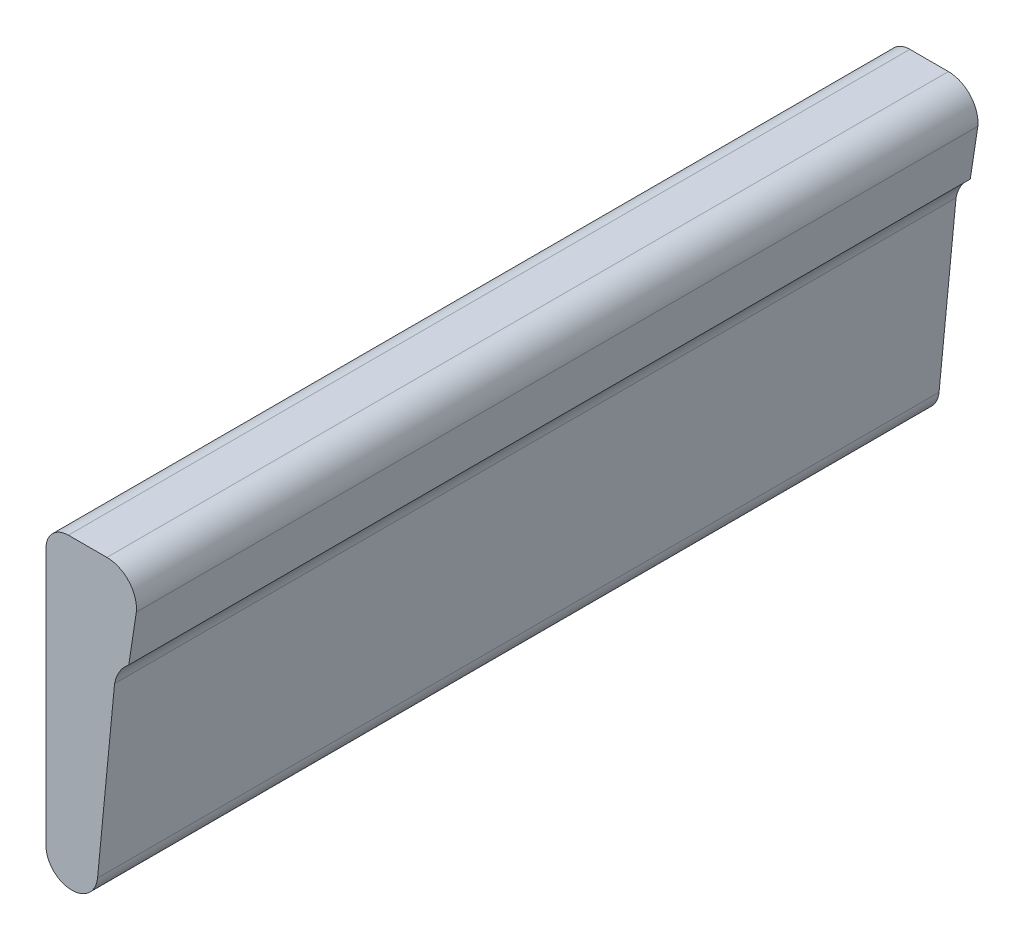
ISO-10303-21;
HEADER;
FILE_DESCRIPTION(('STEP AP214'),'2;1');
FILE_NAME('part.step','',(''),(''),'','','');
FILE_SCHEMA(('AUTOMOTIVE_DESIGN { 1 0 10303 214 1 1 1 1 }'));
ENDSEC;
DATA;
#1=APPLICATION_CONTEXT('core data for automotive mechanical design processes');
#2=APPLICATION_PROTOCOL_DEFINITION('international standard','automotive_design',2000,#1);
#3=PRODUCT_CONTEXT('',#1,'mechanical');
#4=PRODUCT('Part','Part','',(#3));
#5=PRODUCT_RELATED_PRODUCT_CATEGORY('part','',(#4));
#6=PRODUCT_DEFINITION_FORMATION('','',#4);
#7=PRODUCT_DEFINITION_CONTEXT('part definition',#1,'design');
#8=PRODUCT_DEFINITION('design','',#6,#7);
#9=PRODUCT_DEFINITION_SHAPE('','',#8);
#10=(LENGTH_UNIT() NAMED_UNIT(*) SI_UNIT(.MILLI.,.METRE.));
#11=(NAMED_UNIT(*) PLANE_ANGLE_UNIT() SI_UNIT($,.RADIAN.));
#12=(NAMED_UNIT(*) SI_UNIT($,.STERADIAN.) SOLID_ANGLE_UNIT());
#13=UNCERTAINTY_MEASURE_WITH_UNIT(LENGTH_MEASURE(1.E-05),#10,'distance_accuracy_value','');
#14=(GEOMETRIC_REPRESENTATION_CONTEXT(3) GLOBAL_UNCERTAINTY_ASSIGNED_CONTEXT((#13)) GLOBAL_UNIT_ASSIGNED_CONTEXT((#10,
#11,#12)) REPRESENTATION_CONTEXT('',''));
#15=CARTESIAN_POINT('',(0.,0.,0.));
#16=DIRECTION('',(0.,0.,1.));
#17=DIRECTION('',(1.,0.,0.));
#18=AXIS2_PLACEMENT_3D('',#15,#16,#17);
#19=CARTESIAN_POINT('',(13.962836945943,-31.9738409369276,-319.5));
#20=DIRECTION('',(0.,0.,1.));
#21=DIRECTION('',(1.,0.,0.));
#22=AXIS2_PLACEMENT_3D('',#19,#20,#21);
#23=CYLINDRICAL_SURFACE('',#22,11.4544196522527);
#24=CARTESIAN_POINT('',(13.962836945943,-31.9738409369276,3.));
#25=DIRECTION('',(0.,0.,-1.));
#26=DIRECTION('',(-1.,0.,0.));
#27=AXIS2_PLACEMENT_3D('',#24,#25,#26);
#28=CIRCLE('',#27,11.4544196522527);
#29=CARTESIAN_POINT('',(25.3553951783093,-33.1626834378744,3.));
#30=VERTEX_POINT('',#29);
#31=CARTESIAN_POINT('',(13.962836945943,-20.5194212846748,3.));
#32=VERTEX_POINT('',#31);
#33=EDGE_CURVE('E261',#30,#32,#28,.F.);
#34=ORIENTED_EDGE('',*,*,#33,.F.);
#35=DIRECTION('',(0.,0.,1.));
#36=VECTOR('',#35,1.);
#37=CARTESIAN_POINT('',(25.3553951783093,-33.1626834378744,-322.5));
#38=LINE('',#37,#36);
#39=CARTESIAN_POINT('',(25.3553951783093,-33.1626834378744,-322.5));
#40=VERTEX_POINT('',#39);
#41=EDGE_CURVE('E126',#40,#30,#38,.T.);
#42=ORIENTED_EDGE('',*,*,#41,.F.);
#43=CARTESIAN_POINT('',(13.962836945943,-31.9738409369276,-322.5));
#44=DIRECTION('',(0.,0.,-1.));
#45=DIRECTION('',(-1.,0.,0.));
#46=AXIS2_PLACEMENT_3D('',#43,#44,#45);
#47=CIRCLE('',#46,11.4544196522527);
#48=CARTESIAN_POINT('',(13.962836945943,-20.5194212846748,-322.5));
#49=VERTEX_POINT('',#48);
#50=EDGE_CURVE('E194',#40,#49,#47,.F.);
#51=ORIENTED_EDGE('',*,*,#50,.T.);
#52=DIRECTION('',(0.,0.,1.));
#53=VECTOR('',#52,1.);
#54=CARTESIAN_POINT('',(13.962836945943,-20.5194212846748,-319.5));
#55=LINE('',#54,#53);
#56=EDGE_CURVE('E182',#49,#32,#55,.T.);
#57=ORIENTED_EDGE('',*,*,#56,.T.);
#58=EDGE_LOOP('',(#34,#42,#51,#57));
#59=FACE_BOUND('',#58,.T.);
#60=ADVANCED_FACE('F44',(#59),#23,.T.);
#61=CARTESIAN_POINT('',(25.3437338755744,-33.2389304172947,-319.5));
#62=DIRECTION('',(0.988505756164447,-0.151183233295742,0.));
#63=DIRECTION('',(0.151183233295742,0.988505756164447,0.));
#64=AXIS2_PLACEMENT_3D('',#61,#62,#63);
#65=PLANE('',#64);
#66=DIRECTION('',(0.151183233295742,0.988505756164447,0.));
#67=VECTOR('',#66,1.);
#68=CARTESIAN_POINT('',(25.3437338755744,-33.2389304172947,3.));
#69=LINE('',#68,#67);
#70=CARTESIAN_POINT('',(22.4240867341361,-52.328930957468,3.));
#71=VERTEX_POINT('',#70);
#72=EDGE_CURVE('E196',#71,#30,#69,.T.);
#73=ORIENTED_EDGE('',*,*,#72,.F.);
#74=DIRECTION('',(0.,0.,1.));
#75=VECTOR('',#74,1.);
#76=CARTESIAN_POINT('',(22.4240867341361,-52.328930957468,-322.5));
#77=LINE('',#76,#75);
#78=CARTESIAN_POINT('',(22.4240867341361,-52.328930957468,-322.5));
#79=VERTEX_POINT('',#78);
#80=EDGE_CURVE('E253',#79,#71,#77,.T.);
#81=ORIENTED_EDGE('',*,*,#80,.F.);
#82=DIRECTION('',(0.151183233295742,0.988505756164447,0.));
#83=VECTOR('',#82,1.);
#84=CARTESIAN_POINT('',(25.3437338755744,-33.2389304172947,-322.5));
#85=LINE('',#84,#83);
#86=EDGE_CURVE('E264',#79,#40,#85,.T.);
#87=ORIENTED_EDGE('',*,*,#86,.T.);
#88=ORIENTED_EDGE('',*,*,#41,.T.);
#89=EDGE_LOOP('',(#73,#81,#87,#88));
#90=FACE_BOUND('',#89,.T.);
#91=ADVANCED_FACE('F301',(#90),#65,.T.);
#92=CARTESIAN_POINT('',(31.4667033179905,-64.0199701793683,-319.5));
#93=DIRECTION('',(0.,0.,1.));
#94=DIRECTION('',(1.,0.,0.));
#95=AXIS2_PLACEMENT_3D('',#92,#93,#94);
#96=CYLINDRICAL_SURFACE('',#95,14.7800308785405);
#97=CARTESIAN_POINT('',(31.4667033179905,-64.0199701793683,3.));
#98=DIRECTION('',(0.,0.,-1.));
#99=DIRECTION('',(-1.,0.,0.));
#100=AXIS2_PLACEMENT_3D('',#97,#98,#99);
#101=CIRCLE('',#100,14.7800308785405);
#102=CARTESIAN_POINT('',(16.9369475056105,-61.3115557348601,3.));
#103=VERTEX_POINT('',#102);
#104=EDGE_CURVE('E266',#103,#71,#101,.T.);
#105=ORIENTED_EDGE('',*,*,#104,.F.);
#106=DIRECTION('',(0.,0.,1.));
#107=VECTOR('',#106,1.);
#108=CARTESIAN_POINT('',(16.9369475056105,-61.3115557348601,-322.5));
#109=LINE('',#108,#107);
#110=CARTESIAN_POINT('',(16.9369475056105,-61.3115557348601,-322.5));
#111=VERTEX_POINT('',#110);
#112=EDGE_CURVE('E258',#111,#103,#109,.T.);
#113=ORIENTED_EDGE('',*,*,#112,.F.);
#114=CARTESIAN_POINT('',(31.4667033179905,-64.0199701793683,-322.5));
#115=DIRECTION('',(0.,0.,-1.));
#116=DIRECTION('',(-1.,0.,0.));
#117=AXIS2_PLACEMENT_3D('',#114,#115,#116);
#118=CIRCLE('',#117,14.7800308785405);
#119=EDGE_CURVE('E269',#111,#79,#118,.T.);
#120=ORIENTED_EDGE('',*,*,#119,.T.);
#121=ORIENTED_EDGE('',*,*,#80,.T.);
#122=EDGE_LOOP('',(#105,#113,#120,#121));
#123=FACE_BOUND('',#122,.T.);
#124=ADVANCED_FACE('F304',(#123),#96,.F.);
#125=CARTESIAN_POINT('',(10.356738261223,-129.745824367144,-319.5));
#126=DIRECTION('',(0.995409041424573,-0.0957122784715338,0.));
#127=DIRECTION('',(0.0957122784715339,0.995409041424573,0.));
#128=AXIS2_PLACEMENT_3D('',#125,#126,#127);
#129=PLANE('',#128);
#130=DIRECTION('',(0.0957122784715339,0.995409041424573,0.));
#131=VECTOR('',#130,1.);
#132=CARTESIAN_POINT('',(10.356738261223,-129.745824367144,3.));
#133=LINE('',#132,#131);
#134=CARTESIAN_POINT('',(10.356738261223,-129.745824367144,3.));
#135=VERTEX_POINT('',#134);
#136=EDGE_CURVE('E272',#135,#103,#133,.T.);
#137=ORIENTED_EDGE('',*,*,#136,.F.);
#138=DIRECTION('',(0.,0.,1.));
#139=VECTOR('',#138,1.);
#140=CARTESIAN_POINT('',(10.356738261223,-129.745824367144,-319.5));
#141=LINE('',#140,#139);
#142=CARTESIAN_POINT('',(10.356738261223,-129.745824367144,-322.5));
#143=VERTEX_POINT('',#142);
#144=EDGE_CURVE('E274',#143,#135,#141,.T.);
#145=ORIENTED_EDGE('',*,*,#144,.F.);
#146=DIRECTION('',(0.0957122784715339,0.995409041424573,0.));
#147=VECTOR('',#146,1.);
#148=CARTESIAN_POINT('',(10.356738261223,-129.745824367144,-322.5));
#149=LINE('',#148,#147);
#150=EDGE_CURVE('E277',#143,#111,#149,.T.);
#151=ORIENTED_EDGE('',*,*,#150,.T.);
#152=ORIENTED_EDGE('',*,*,#112,.T.);
#153=EDGE_LOOP('',(#137,#145,#151,#152));
#154=FACE_BOUND('',#153,.T.);
#155=ADVANCED_FACE('F308',(#154),#129,.T.);
#156=CARTESIAN_POINT('',(0.393517748956527,-128.787823689574,-319.5));
#157=DIRECTION('',(0.,0.,1.));
#158=DIRECTION('',(1.,0.,0.));
#159=AXIS2_PLACEMENT_3D('',#156,#157,#158);
#160=CYLINDRICAL_SURFACE('',#159,10.0091722072443);
#161=CARTESIAN_POINT('',(0.393517748956527,-128.787823689574,3.));
#162=DIRECTION('',(0.,0.,-1.));
#163=DIRECTION('',(-1.,0.,0.));
#164=AXIS2_PLACEMENT_3D('',#161,#162,#163);
#165=CIRCLE('',#164,10.0091722072443);
#166=CARTESIAN_POINT('',(-9.58373653435743,-129.586525912161,3.));
#167=VERTEX_POINT('',#166);
#168=EDGE_CURVE('E280',#167,#135,#165,.F.);
#169=ORIENTED_EDGE('',*,*,#168,.F.);
#170=DIRECTION('',(0.,0.,1.));
#171=VECTOR('',#170,1.);
#172=CARTESIAN_POINT('',(-9.58373653435743,-129.586525912161,-322.5));
#173=LINE('',#172,#171);
#174=CARTESIAN_POINT('',(-9.58373653435743,-129.586525912161,-322.5));
#175=VERTEX_POINT('',#174);
#176=EDGE_CURVE('E282',#175,#167,#173,.T.);
#177=ORIENTED_EDGE('',*,*,#176,.F.);
#178=CARTESIAN_POINT('',(0.393517748956527,-128.787823689574,-322.5));
#179=DIRECTION('',(0.,0.,-1.));
#180=DIRECTION('',(-1.,0.,0.));
#181=AXIS2_PLACEMENT_3D('',#178,#179,#180);
#182=CIRCLE('',#181,10.0091722072443);
#183=EDGE_CURVE('E285',#175,#143,#182,.F.);
#184=ORIENTED_EDGE('',*,*,#183,.T.);
#185=ORIENTED_EDGE('',*,*,#144,.T.);
#186=EDGE_LOOP('',(#169,#177,#184,#185));
#187=FACE_BOUND('',#186,.T.);
#188=ADVANCED_FACE('F311',(#187),#160,.T.);
#189=CARTESIAN_POINT('',(-9.58373653435743,-28.7977437566073,-319.5));
#190=DIRECTION('',(-1.,0.,0.));
#191=DIRECTION('',(0.,0.,1.));
#192=AXIS2_PLACEMENT_3D('',#189,#190,#191);
#193=PLANE('',#192);
#194=DIRECTION('',(0.,-1.,0.));
#195=VECTOR('',#194,1.);
#196=CARTESIAN_POINT('',(-9.58373653435743,-28.7977437566073,3.));
#197=LINE('',#196,#195);
#198=CARTESIAN_POINT('',(-9.58373653435743,-28.703056795693,3.));
#199=VERTEX_POINT('',#198);
#200=EDGE_CURVE('E288',#199,#167,#197,.T.);
#201=ORIENTED_EDGE('',*,*,#200,.F.);
#202=DIRECTION('',(0.,0.,1.));
#203=VECTOR('',#202,1.);
#204=CARTESIAN_POINT('',(-9.58373653435743,-28.703056795693,-322.5));
#205=LINE('',#204,#203);
#206=CARTESIAN_POINT('',(-9.58373653435743,-28.703056795693,-322.5));
#207=VERTEX_POINT('',#206);
#208=EDGE_CURVE('E181',#207,#199,#205,.T.);
#209=ORIENTED_EDGE('',*,*,#208,.F.);
#210=DIRECTION('',(0.,-1.,0.));
#211=VECTOR('',#210,1.);
#212=CARTESIAN_POINT('',(-9.58373653435743,-28.7977437566073,-322.5));
#213=LINE('',#212,#211);
#214=EDGE_CURVE('E191',#207,#175,#213,.T.);
#215=ORIENTED_EDGE('',*,*,#214,.T.);
#216=ORIENTED_EDGE('',*,*,#176,.T.);
#217=EDGE_LOOP('',(#201,#209,#215,#216));
#218=FACE_BOUND('',#217,.T.);
#219=ADVANCED_FACE('F314',(#218),#193,.T.);
#220=CARTESIAN_POINT('',(-0.919188983830335,-29.1980992537325,-319.5));
#221=DIRECTION('',(0.,0.,1.));
#222=DIRECTION('',(1.,0.,0.));
#223=AXIS2_PLACEMENT_3D('',#220,#221,#222);
#224=CYLINDRICAL_SURFACE('',#223,8.67867796905766);
#225=CARTESIAN_POINT('',(-0.919188983830335,-29.1980992537325,3.));
#226=DIRECTION('',(0.,0.,-1.));
#227=DIRECTION('',(-1.,0.,0.));
#228=AXIS2_PLACEMENT_3D('',#225,#226,#227);
#229=CIRCLE('',#228,8.67867796905766);
#230=CARTESIAN_POINT('',(-0.919188983830335,-20.5194212846748,3.));
#231=VERTEX_POINT('',#230);
#232=EDGE_CURVE('E176',#231,#199,#229,.F.);
#233=ORIENTED_EDGE('',*,*,#232,.F.);
#234=DIRECTION('',(0.,0.,1.));
#235=VECTOR('',#234,1.);
#236=CARTESIAN_POINT('',(-0.919188983830335,-20.5194212846748,-319.5));
#237=LINE('',#236,#235);
#238=CARTESIAN_POINT('',(-0.919188983830335,-20.5194212846748,-322.5));
#239=VERTEX_POINT('',#238);
#240=EDGE_CURVE('E171',#239,#231,#237,.T.);
#241=ORIENTED_EDGE('',*,*,#240,.F.);
#242=CARTESIAN_POINT('',(-0.919188983830335,-29.1980992537325,-322.5));
#243=DIRECTION('',(0.,0.,-1.));
#244=DIRECTION('',(-1.,0.,0.));
#245=AXIS2_PLACEMENT_3D('',#242,#243,#244);
#246=CIRCLE('',#245,8.67867796905766);
#247=EDGE_CURVE('E174',#239,#207,#246,.F.);
#248=ORIENTED_EDGE('',*,*,#247,.T.);
#249=ORIENTED_EDGE('',*,*,#208,.T.);
#250=EDGE_LOOP('',(#233,#241,#248,#249));
#251=FACE_BOUND('',#250,.T.);
#252=ADVANCED_FACE('F173',(#251),#224,.T.);
#253=CARTESIAN_POINT('',(13.962836945943,-20.5194212846748,-319.5));
#254=DIRECTION('',(0.,1.,0.));
#255=DIRECTION('',(0.,0.,1.));
#256=AXIS2_PLACEMENT_3D('',#253,#254,#255);
#257=PLANE('',#256);
#258=DIRECTION('',(-1.,0.,0.));
#259=VECTOR('',#258,1.);
#260=CARTESIAN_POINT('',(13.962836945943,-20.5194212846748,3.));
#261=LINE('',#260,#259);
#262=EDGE_CURVE('E199',#32,#231,#261,.T.);
#263=ORIENTED_EDGE('',*,*,#262,.F.);
#264=ORIENTED_EDGE('',*,*,#56,.F.);
#265=DIRECTION('',(-1.,0.,0.));
#266=VECTOR('',#265,1.);
#267=CARTESIAN_POINT('',(13.962836945943,-20.5194212846748,-322.5));
#268=LINE('',#267,#266);
#269=EDGE_CURVE('E188',#49,#239,#268,.T.);
#270=ORIENTED_EDGE('',*,*,#269,.T.);
#271=ORIENTED_EDGE('',*,*,#240,.T.);
#272=EDGE_LOOP('',(#263,#264,#270,#271));
#273=FACE_BOUND('',#272,.T.);
#274=ADVANCED_FACE('F193',(#273),#257,.T.);
#275=CARTESIAN_POINT('',(13.962836945943,-31.9738409369276,-322.5));
#276=DIRECTION('',(0.,0.,-1.));
#277=DIRECTION('',(-1.,0.,0.));
#278=AXIS2_PLACEMENT_3D('',#275,#276,#277);
#279=PLANE('',#278);
#280=ORIENTED_EDGE('',*,*,#50,.F.);
#281=ORIENTED_EDGE('',*,*,#86,.F.);
#282=ORIENTED_EDGE('',*,*,#119,.F.);
#283=ORIENTED_EDGE('',*,*,#150,.F.);
#284=ORIENTED_EDGE('',*,*,#183,.F.);
#285=ORIENTED_EDGE('',*,*,#214,.F.);
#286=ORIENTED_EDGE('',*,*,#247,.F.);
#287=ORIENTED_EDGE('',*,*,#269,.F.);
#288=EDGE_LOOP('',(#280,#281,#282,#283,#284,#285,#286,#287));
#289=FACE_BOUND('',#288,.T.);
#290=ADVANCED_FACE('F187',(#289),#279,.T.);
#291=CARTESIAN_POINT('',(13.962836945943,-31.9738409369276,3.));
#292=DIRECTION('',(0.,0.,-1.));
#293=DIRECTION('',(-1.,0.,0.));
#294=AXIS2_PLACEMENT_3D('',#291,#292,#293);
#295=PLANE('',#294);
#296=ORIENTED_EDGE('',*,*,#33,.T.);
#297=ORIENTED_EDGE('',*,*,#262,.T.);
#298=ORIENTED_EDGE('',*,*,#232,.T.);
#299=ORIENTED_EDGE('',*,*,#200,.T.);
#300=ORIENTED_EDGE('',*,*,#168,.T.);
#301=ORIENTED_EDGE('',*,*,#136,.T.);
#302=ORIENTED_EDGE('',*,*,#104,.T.);
#303=ORIENTED_EDGE('',*,*,#72,.T.);
#304=EDGE_LOOP('',(#296,#297,#298,#299,#300,#301,#302,#303));
#305=FACE_BOUND('',#304,.T.);
#306=ADVANCED_FACE('F298',(#305),#295,.F.);
#307=CLOSED_SHELL('',(#60,#91,#124,#155,#188,#219,#252,#274,#290,#306));
#308=CARTESIAN_POINT('',(13.962836945943,-31.9738409369276,-319.5));
#309=DIRECTION('',(0.,0.,1.));
#310=DIRECTION('',(1.,0.,0.));
#311=AXIS2_PLACEMENT_3D('',#308,#309,#310);
#312=CYLINDRICAL_SURFACE('',#311,8.45441965225271);
#313=CARTESIAN_POINT('',(13.962836945943,-31.9738409369276,0.));
#314=DIRECTION('',(0.,0.,1.));
#315=DIRECTION('',(-1.,0.,0.));
#316=AXIS2_PLACEMENT_3D('',#313,#314,#315);
#317=CIRCLE('',#316,8.45441965225271);
#318=CARTESIAN_POINT('',(22.3782166070811,-32.7853807174074,0.));
#319=VERTEX_POINT('',#318);
#320=CARTESIAN_POINT('',(13.962836945943,-23.5194212846748,0.));
#321=VERTEX_POINT('',#320);
#322=EDGE_CURVE('E216',#319,#321,#317,.T.);
#323=ORIENTED_EDGE('',*,*,#322,.T.);
#324=DIRECTION('',(0.,0.,1.));
#325=VECTOR('',#324,1.);
#326=CARTESIAN_POINT('',(13.962836945943,-23.5194212846748,-319.5));
#327=LINE('',#326,#325);
#328=CARTESIAN_POINT('',(13.962836945943,-23.5194212846748,-319.5));
#329=VERTEX_POINT('',#328);
#330=EDGE_CURVE('E111',#329,#321,#327,.T.);
#331=ORIENTED_EDGE('',*,*,#330,.F.);
#332=CARTESIAN_POINT('',(13.962836945943,-31.9738409369276,-319.5));
#333=DIRECTION('',(0.,0.,1.));
#334=DIRECTION('',(-1.,0.,0.));
#335=AXIS2_PLACEMENT_3D('',#332,#333,#334);
#336=CIRCLE('',#335,8.45441965225271);
#337=CARTESIAN_POINT('',(22.3782166070811,-32.7853807174074,-319.5));
#338=VERTEX_POINT('',#337);
#339=EDGE_CURVE('E48',#338,#329,#336,.T.);
#340=ORIENTED_EDGE('',*,*,#339,.F.);
#341=DIRECTION('',(0.,0.,1.));
#342=VECTOR('',#341,1.);
#343=CARTESIAN_POINT('',(22.3782166070811,-32.7853807174074,-319.5));
#344=LINE('',#343,#342);
#345=EDGE_CURVE('E117',#338,#319,#344,.T.);
#346=ORIENTED_EDGE('',*,*,#345,.T.);
#347=EDGE_LOOP('',(#323,#331,#340,#346));
#348=FACE_BOUND('',#347,.T.);
#349=ADVANCED_FACE('F382',(#348),#312,.F.);
#350=CARTESIAN_POINT('',(22.3782166070811,-32.7853807174074,-319.5));
#351=DIRECTION('',(0.988505756164447,-0.151183233295742,0.));
#352=DIRECTION('',(0.151183233295742,0.988505756164447,0.));
#353=AXIS2_PLACEMENT_3D('',#350,#351,#352);
#354=PLANE('',#353);
#355=DIRECTION('',(0.151183233295742,0.988505756164447,0.));
#356=VECTOR('',#355,1.);
#357=CARTESIAN_POINT('',(22.3782166070811,-32.7853807174074,0.));
#358=LINE('',#357,#356);
#359=CARTESIAN_POINT('',(19.6303268731132,-50.7523520548891,0.));
#360=VERTEX_POINT('',#359);
#361=EDGE_CURVE('E11',#360,#319,#358,.T.);
#362=ORIENTED_EDGE('',*,*,#361,.T.);
#363=ORIENTED_EDGE('',*,*,#345,.F.);
#364=DIRECTION('',(0.151183233295742,0.988505756164447,0.));
#365=VECTOR('',#364,1.);
#366=CARTESIAN_POINT('',(22.3782166070811,-32.7853807174074,-319.5));
#367=LINE('',#366,#365);
#368=CARTESIAN_POINT('',(19.6303268731132,-50.7523520548891,-319.5));
#369=VERTEX_POINT('',#368);
#370=EDGE_CURVE('E249',#369,#338,#367,.T.);
#371=ORIENTED_EDGE('',*,*,#370,.F.);
#372=DIRECTION('',(0.,0.,1.));
#373=VECTOR('',#372,1.);
#374=CARTESIAN_POINT('',(19.6303268731132,-50.7523520548891,-319.5));
#375=LINE('',#374,#373);
#376=EDGE_CURVE('E243',#369,#360,#375,.T.);
#377=ORIENTED_EDGE('',*,*,#376,.T.);
#378=EDGE_LOOP('',(#362,#363,#371,#377));
#379=FACE_BOUND('',#378,.T.);
#380=ADVANCED_FACE('F385',(#379),#354,.F.);
#381=CARTESIAN_POINT('',(31.4667033179905,-64.0199701793683,-319.5));
#382=DIRECTION('',(0.,0.,1.));
#383=DIRECTION('',(1.,0.,0.));
#384=AXIS2_PLACEMENT_3D('',#381,#382,#383);
#385=CYLINDRICAL_SURFACE('',#384,17.7800308785405);
#386=CARTESIAN_POINT('',(31.4667033179905,-64.0199701793683,0.));
#387=DIRECTION('',(0.,0.,-1.));
#388=DIRECTION('',(1.,0.,0.));
#389=AXIS2_PLACEMENT_3D('',#386,#387,#388);
#390=CIRCLE('',#389,17.7800308785405);
#391=CARTESIAN_POINT('',(13.962836945943,-60.8984064572317,0.));
#392=VERTEX_POINT('',#391);
#393=EDGE_CURVE('E55',#392,#360,#390,.T.);
#394=ORIENTED_EDGE('',*,*,#393,.T.);
#395=ORIENTED_EDGE('',*,*,#376,.F.);
#396=CARTESIAN_POINT('',(31.4667033179905,-64.0199701793683,-319.5));
#397=DIRECTION('',(0.,0.,-1.));
#398=DIRECTION('',(1.,0.,0.));
#399=AXIS2_PLACEMENT_3D('',#396,#397,#398);
#400=CIRCLE('',#399,17.7800308785405);
#401=CARTESIAN_POINT('',(13.962836945943,-60.8984064572317,-319.5));
#402=VERTEX_POINT('',#401);
#403=EDGE_CURVE('E245',#402,#369,#400,.T.);
#404=ORIENTED_EDGE('',*,*,#403,.F.);
#405=DIRECTION('',(0.,0.,1.));
#406=VECTOR('',#405,1.);
#407=CARTESIAN_POINT('',(13.962836945943,-60.8984064572317,-319.5));
#408=LINE('',#407,#406);
#409=EDGE_CURVE('E238',#402,#392,#408,.T.);
#410=ORIENTED_EDGE('',*,*,#409,.T.);
#411=EDGE_LOOP('',(#394,#395,#404,#410));
#412=FACE_BOUND('',#411,.T.);
#413=ADVANCED_FACE('F394',(#412),#385,.T.);
#414=CARTESIAN_POINT('',(7.37051113694931,-129.458687531729,-319.5));
#415=DIRECTION('',(0.995409041424573,-0.0957122784715338,0.));
#416=DIRECTION('',(0.0957122784715339,0.995409041424573,0.));
#417=AXIS2_PLACEMENT_3D('',#414,#415,#416);
#418=PLANE('',#417);
#419=DIRECTION('',(0.0957122784715338,0.995409041424573,0.));
#420=VECTOR('',#419,1.);
#421=CARTESIAN_POINT('',(7.37051113694931,-129.458687531729,0.));
#422=LINE('',#421,#420);
#423=CARTESIAN_POINT('',(7.37051113694931,-129.458687531729,0.));
#424=VERTEX_POINT('',#423);
#425=EDGE_CURVE('E203',#424,#392,#422,.T.);
#426=ORIENTED_EDGE('',*,*,#425,.T.);
#427=ORIENTED_EDGE('',*,*,#409,.F.);
#428=DIRECTION('',(0.0957122784715338,0.995409041424573,0.));
#429=VECTOR('',#428,1.);
#430=CARTESIAN_POINT('',(7.37051113694931,-129.458687531729,-319.5));
#431=LINE('',#430,#429);
#432=CARTESIAN_POINT('',(7.37051113694931,-129.458687531729,-319.5));
#433=VERTEX_POINT('',#432);
#434=EDGE_CURVE('E240',#433,#402,#431,.T.);
#435=ORIENTED_EDGE('',*,*,#434,.F.);
#436=DIRECTION('',(0.,0.,1.));
#437=VECTOR('',#436,1.);
#438=CARTESIAN_POINT('',(7.37051113694931,-129.458687531729,-319.5));
#439=LINE('',#438,#437);
#440=EDGE_CURVE('E233',#433,#424,#439,.T.);
#441=ORIENTED_EDGE('',*,*,#440,.T.);
#442=EDGE_LOOP('',(#426,#427,#435,#441));
#443=FACE_BOUND('',#442,.T.);
#444=ADVANCED_FACE('F401',(#443),#418,.F.);
#445=CARTESIAN_POINT('',(0.393517748956527,-128.787823689574,-319.5));
#446=DIRECTION('',(0.,0.,1.));
#447=DIRECTION('',(1.,0.,0.));
#448=AXIS2_PLACEMENT_3D('',#445,#446,#447);
#449=CYLINDRICAL_SURFACE('',#448,7.00917220724427);
#450=CARTESIAN_POINT('',(0.393517748956527,-128.787823689574,0.));
#451=DIRECTION('',(0.,0.,1.));
#452=DIRECTION('',(-1.,0.,0.));
#453=AXIS2_PLACEMENT_3D('',#450,#451,#452);
#454=CIRCLE('',#453,7.00917220724427);
#455=CARTESIAN_POINT('',(-6.58373653435742,-129.455968656466,0.));
#456=VERTEX_POINT('',#455);
#457=EDGE_CURVE('E206',#456,#424,#454,.T.);
#458=ORIENTED_EDGE('',*,*,#457,.T.);
#459=ORIENTED_EDGE('',*,*,#440,.F.);
#460=CARTESIAN_POINT('',(0.393517748956527,-128.787823689574,-319.5));
#461=DIRECTION('',(0.,0.,1.));
#462=DIRECTION('',(-1.,0.,0.));
#463=AXIS2_PLACEMENT_3D('',#460,#461,#462);
#464=CIRCLE('',#463,7.00917220724427);
#465=CARTESIAN_POINT('',(-6.58373653435742,-129.455968656466,-319.5));
#466=VERTEX_POINT('',#465);
#467=EDGE_CURVE('E235',#466,#433,#464,.T.);
#468=ORIENTED_EDGE('',*,*,#467,.F.);
#469=DIRECTION('',(0.,0.,1.));
#470=VECTOR('',#469,1.);
#471=CARTESIAN_POINT('',(-6.58373653435742,-129.455968656466,-319.5));
#472=LINE('',#471,#470);
#473=EDGE_CURVE('E228',#466,#456,#472,.T.);
#474=ORIENTED_EDGE('',*,*,#473,.T.);
#475=EDGE_LOOP('',(#458,#459,#468,#474));
#476=FACE_BOUND('',#475,.T.);
#477=ADVANCED_FACE('F409',(#476),#449,.F.);
#478=CARTESIAN_POINT('',(-6.58373653435742,-28.7977437566073,-319.5));
#479=DIRECTION('',(-1.,0.,0.));
#480=DIRECTION('',(0.,0.,1.));
#481=AXIS2_PLACEMENT_3D('',#478,#479,#480);
#482=PLANE('',#481);
#483=DIRECTION('',(0.,-1.,0.));
#484=VECTOR('',#483,1.);
#485=CARTESIAN_POINT('',(-6.58373653435742,-28.7977437566073,0.));
#486=LINE('',#485,#484);
#487=CARTESIAN_POINT('',(-6.58373653435742,-28.7977437566073,0.));
#488=VERTEX_POINT('',#487);
#489=EDGE_CURVE('E209',#488,#456,#486,.T.);
#490=ORIENTED_EDGE('',*,*,#489,.T.);
#491=ORIENTED_EDGE('',*,*,#473,.F.);
#492=DIRECTION('',(0.,-1.,0.));
#493=VECTOR('',#492,1.);
#494=CARTESIAN_POINT('',(-6.58373653435742,-28.7977437566073,-319.5));
#495=LINE('',#494,#493);
#496=CARTESIAN_POINT('',(-6.58373653435742,-28.7977437566073,-319.5));
#497=VERTEX_POINT('',#496);
#498=EDGE_CURVE('E230',#497,#466,#495,.T.);
#499=ORIENTED_EDGE('',*,*,#498,.F.);
#500=DIRECTION('',(0.,0.,1.));
#501=VECTOR('',#500,1.);
#502=CARTESIAN_POINT('',(-6.58373653435742,-28.7977437566073,-319.5));
#503=LINE('',#502,#501);
#504=EDGE_CURVE('E223',#497,#488,#503,.T.);
#505=ORIENTED_EDGE('',*,*,#504,.T.);
#506=EDGE_LOOP('',(#490,#491,#499,#505));
#507=FACE_BOUND('',#506,.T.);
#508=ADVANCED_FACE('F417',(#507),#482,.F.);
#509=CARTESIAN_POINT('',(-0.919188983830335,-29.1980992537325,-319.5));
#510=DIRECTION('',(0.,0.,1.));
#511=DIRECTION('',(1.,0.,0.));
#512=AXIS2_PLACEMENT_3D('',#509,#510,#511);
#513=CYLINDRICAL_SURFACE('',#512,5.67867796905766);
#514=CARTESIAN_POINT('',(-0.919188983830335,-29.1980992537325,0.));
#515=DIRECTION('',(0.,0.,1.));
#516=DIRECTION('',(1.,0.,0.));
#517=AXIS2_PLACEMENT_3D('',#514,#515,#516);
#518=CIRCLE('',#517,5.67867796905766);
#519=CARTESIAN_POINT('',(-0.919188983830335,-23.5194212846748,0.));
#520=VERTEX_POINT('',#519);
#521=EDGE_CURVE('E212',#520,#488,#518,.T.);
#522=ORIENTED_EDGE('',*,*,#521,.T.);
#523=ORIENTED_EDGE('',*,*,#504,.F.);
#524=CARTESIAN_POINT('',(-0.919188983830335,-29.1980992537325,-319.5));
#525=DIRECTION('',(0.,0.,1.));
#526=DIRECTION('',(1.,0.,0.));
#527=AXIS2_PLACEMENT_3D('',#524,#525,#526);
#528=CIRCLE('',#527,5.67867796905766);
#529=CARTESIAN_POINT('',(-0.919188983830335,-23.5194212846748,-319.5));
#530=VERTEX_POINT('',#529);
#531=EDGE_CURVE('E225',#530,#497,#528,.T.);
#532=ORIENTED_EDGE('',*,*,#531,.F.);
#533=DIRECTION('',(0.,0.,1.));
#534=VECTOR('',#533,1.);
#535=CARTESIAN_POINT('',(-0.919188983830335,-23.5194212846748,-319.5));
#536=LINE('',#535,#534);
#537=EDGE_CURVE('E64',#530,#520,#536,.T.);
#538=ORIENTED_EDGE('',*,*,#537,.T.);
#539=EDGE_LOOP('',(#522,#523,#532,#538));
#540=FACE_BOUND('',#539,.T.);
#541=ADVANCED_FACE('F425',(#540),#513,.F.);
#542=CARTESIAN_POINT('',(13.962836945943,-23.5194212846748,-319.5));
#543=DIRECTION('',(0.,1.,0.));
#544=DIRECTION('',(0.,0.,1.));
#545=AXIS2_PLACEMENT_3D('',#542,#543,#544);
#546=PLANE('',#545);
#547=DIRECTION('',(-1.,0.,0.));
#548=VECTOR('',#547,1.);
#549=CARTESIAN_POINT('',(13.962836945943,-23.5194212846748,0.));
#550=LINE('',#549,#548);
#551=EDGE_CURVE('E214',#321,#520,#550,.T.);
#552=ORIENTED_EDGE('',*,*,#551,.T.);
#553=ORIENTED_EDGE('',*,*,#537,.F.);
#554=DIRECTION('',(-1.,0.,0.));
#555=VECTOR('',#554,1.);
#556=CARTESIAN_POINT('',(13.962836945943,-23.5194212846748,-319.5));
#557=LINE('',#556,#555);
#558=EDGE_CURVE('E220',#329,#530,#557,.T.);
#559=ORIENTED_EDGE('',*,*,#558,.F.);
#560=ORIENTED_EDGE('',*,*,#330,.T.);
#561=EDGE_LOOP('',(#552,#553,#559,#560));
#562=FACE_BOUND('',#561,.T.);
#563=ADVANCED_FACE('F433',(#562),#546,.F.);
#564=CARTESIAN_POINT('',(13.962836945943,-31.9738409369276,-319.5));
#565=DIRECTION('',(0.,0.,-1.));
#566=DIRECTION('',(-1.,0.,0.));
#567=AXIS2_PLACEMENT_3D('',#564,#565,#566);
#568=PLANE('',#567);
#569=ORIENTED_EDGE('',*,*,#339,.T.);
#570=ORIENTED_EDGE('',*,*,#558,.T.);
#571=ORIENTED_EDGE('',*,*,#531,.T.);
#572=ORIENTED_EDGE('',*,*,#498,.T.);
#573=ORIENTED_EDGE('',*,*,#467,.T.);
#574=ORIENTED_EDGE('',*,*,#434,.T.);
#575=ORIENTED_EDGE('',*,*,#403,.T.);
#576=ORIENTED_EDGE('',*,*,#370,.T.);
#577=EDGE_LOOP('',(#569,#570,#571,#572,#573,#574,#575,#576));
#578=FACE_BOUND('',#577,.T.);
#579=ADVANCED_FACE('F440',(#578),#568,.F.);
#580=CARTESIAN_POINT('',(13.962836945943,-31.9738409369276,0.));
#581=DIRECTION('',(0.,0.,-1.));
#582=DIRECTION('',(-1.,0.,0.));
#583=AXIS2_PLACEMENT_3D('',#580,#581,#582);
#584=PLANE('',#583);
#585=ORIENTED_EDGE('',*,*,#322,.F.);
#586=ORIENTED_EDGE('',*,*,#361,.F.);
#587=ORIENTED_EDGE('',*,*,#393,.F.);
#588=ORIENTED_EDGE('',*,*,#425,.F.);
#589=ORIENTED_EDGE('',*,*,#457,.F.);
#590=ORIENTED_EDGE('',*,*,#489,.F.);
#591=ORIENTED_EDGE('',*,*,#521,.F.);
#592=ORIENTED_EDGE('',*,*,#551,.F.);
#593=EDGE_LOOP('',(#585,#586,#587,#588,#589,#590,#591,#592));
#594=FACE_BOUND('',#593,.T.);
#595=ADVANCED_FACE('F46',(#594),#584,.T.);
#596=CLOSED_SHELL('',(#349,#380,#413,#444,#477,#508,#541,#563,#579,#595));
#597=ORIENTED_CLOSED_SHELL('',*,#596,.T.);
#598=BREP_WITH_VOIDS('B2',#307,(#597));
#599=ADVANCED_BREP_SHAPE_REPRESENTATION('',(#18,#598),#14);
#600=SHAPE_DEFINITION_REPRESENTATION(#9,#599);
ENDSEC;
END-ISO-10303-21;
